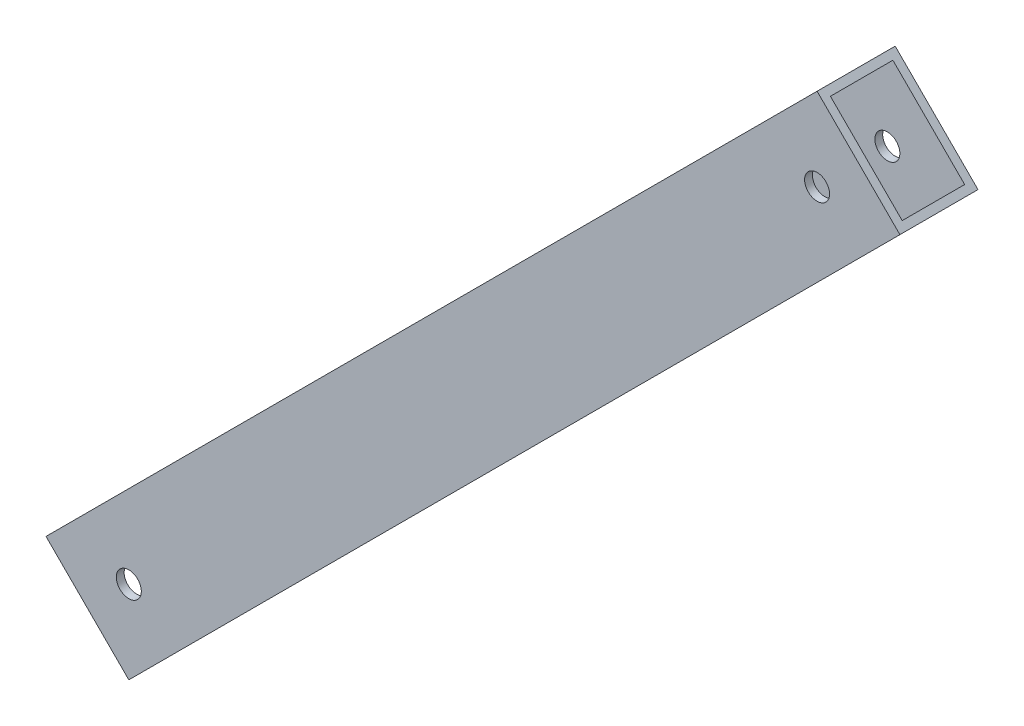
ISO-10303-21;
HEADER;
FILE_DESCRIPTION(('STEP AP214'),'2;1');
FILE_NAME('part.step','',(''),(''),'','','');
FILE_SCHEMA(('AUTOMOTIVE_DESIGN { 1 0 10303 214 1 1 1 1 }'));
ENDSEC;
DATA;
#1=APPLICATION_CONTEXT('core data for automotive mechanical design processes');
#2=APPLICATION_PROTOCOL_DEFINITION('international standard','automotive_design',2000,#1);
#3=PRODUCT_CONTEXT('',#1,'mechanical');
#4=PRODUCT('Part','Part','',(#3));
#5=PRODUCT_RELATED_PRODUCT_CATEGORY('part','',(#4));
#6=PRODUCT_DEFINITION_FORMATION('','',#4);
#7=PRODUCT_DEFINITION_CONTEXT('part definition',#1,'design');
#8=PRODUCT_DEFINITION('design','',#6,#7);
#9=PRODUCT_DEFINITION_SHAPE('','',#8);
#10=(LENGTH_UNIT() NAMED_UNIT(*) SI_UNIT(.MILLI.,.METRE.));
#11=(NAMED_UNIT(*) PLANE_ANGLE_UNIT() SI_UNIT($,.RADIAN.));
#12=(NAMED_UNIT(*) SI_UNIT($,.STERADIAN.) SOLID_ANGLE_UNIT());
#13=UNCERTAINTY_MEASURE_WITH_UNIT(LENGTH_MEASURE(1.E-05),#10,'distance_accuracy_value','');
#14=(GEOMETRIC_REPRESENTATION_CONTEXT(3) GLOBAL_UNCERTAINTY_ASSIGNED_CONTEXT((#13)) GLOBAL_UNIT_ASSIGNED_CONTEXT((#10,
#11,#12)) REPRESENTATION_CONTEXT('',''));
#15=CARTESIAN_POINT('',(0.,0.,0.));
#16=DIRECTION('',(0.,0.,1.));
#17=DIRECTION('',(1.,0.,0.));
#18=AXIS2_PLACEMENT_3D('',#15,#16,#17);
#19=CARTESIAN_POINT('',(177.355249324951,-95.6447506750465,10.));
#20=DIRECTION('',(0.,0.,-1.));
#21=DIRECTION('',(-1.,0.,0.));
#22=AXIS2_PLACEMENT_3D('',#19,#20,#21);
#23=CYLINDRICAL_SURFACE('',#22,1.59999999999996);
#24=CARTESIAN_POINT('',(177.355249324951,-95.6447506750465,9.));
#25=DIRECTION('',(0.,0.,1.));
#26=DIRECTION('',(1.,0.,0.));
#27=AXIS2_PLACEMENT_3D('',#24,#25,#26);
#28=CIRCLE('',#27,1.59999999999996);
#29=CARTESIAN_POINT('',(178.955249324951,-95.6447506750465,9.));
#30=VERTEX_POINT('',#29);
#31=EDGE_CURVE('E140',#30,#30,#28,.T.);
#32=ORIENTED_EDGE('',*,*,#31,.F.);
#33=EDGE_LOOP('',(#32));
#34=FACE_BOUND('',#33,.T.);
#35=CARTESIAN_POINT('',(177.355249324951,-95.6447506750465,10.));
#36=DIRECTION('',(0.,0.,1.));
#37=DIRECTION('',(1.,0.,0.));
#38=AXIS2_PLACEMENT_3D('',#35,#36,#37);
#39=CIRCLE('',#38,1.59999999999996);
#40=CARTESIAN_POINT('',(178.955249324951,-95.6447506750465,10.));
#41=VERTEX_POINT('',#40);
#42=EDGE_CURVE('E159',#41,#41,#39,.T.);
#43=ORIENTED_EDGE('',*,*,#42,.T.);
#44=EDGE_LOOP('',(#43));
#45=FACE_BOUND('',#44,.T.);
#46=ADVANCED_FACE('F33',(#34,#45),#23,.F.);
#47=CARTESIAN_POINT('',(265.500000000001,-7.49999999999862,10.));
#48=DIRECTION('',(0.,0.,-1.));
#49=DIRECTION('',(-1.,0.,0.));
#50=AXIS2_PLACEMENT_3D('',#47,#48,#49);
#51=CYLINDRICAL_SURFACE('',#50,1.59999999999996);
#52=CARTESIAN_POINT('',(265.500000000001,-7.49999999999862,9.));
#53=DIRECTION('',(0.,0.,1.));
#54=DIRECTION('',(1.,0.,0.));
#55=AXIS2_PLACEMENT_3D('',#52,#53,#54);
#56=CIRCLE('',#55,1.59999999999996);
#57=CARTESIAN_POINT('',(267.100000000001,-7.49999999999862,9.));
#58=VERTEX_POINT('',#57);
#59=EDGE_CURVE('E37',#58,#58,#56,.T.);
#60=ORIENTED_EDGE('',*,*,#59,.F.);
#61=EDGE_LOOP('',(#60));
#62=FACE_BOUND('',#61,.T.);
#63=CARTESIAN_POINT('',(265.500000000001,-7.49999999999862,10.));
#64=DIRECTION('',(0.,0.,1.));
#65=DIRECTION('',(1.,0.,0.));
#66=AXIS2_PLACEMENT_3D('',#63,#64,#65);
#67=CIRCLE('',#66,1.59999999999996);
#68=CARTESIAN_POINT('',(267.100000000001,-7.49999999999862,10.));
#69=VERTEX_POINT('',#68);
#70=EDGE_CURVE('E153',#69,#69,#67,.T.);
#71=ORIENTED_EDGE('',*,*,#70,.T.);
#72=EDGE_LOOP('',(#71));
#73=FACE_BOUND('',#72,.T.);
#74=ADVANCED_FACE('F203',(#62,#73),#51,.F.);
#75=CARTESIAN_POINT('',(195.032918854614,-95.6447506750468,5.00000000000004));
#76=DIRECTION('',(-0.707106781186537,0.707106781186558,0.));
#77=DIRECTION('',(-0.707106781186558,-0.707106781186537,0.));
#78=AXIS2_PLACEMENT_3D('',#75,#76,#77);
#79=CYLINDRICAL_SURFACE('',#78,1.6);
#80=CARTESIAN_POINT('',(181.59789001207,-82.2097218325023,5.00000000000004));
#81=DIRECTION('',(-0.707106781186537,0.707106781186558,0.));
#82=DIRECTION('',(-0.707106781186558,-0.707106781186537,0.));
#83=AXIS2_PLACEMENT_3D('',#80,#81,#82);
#84=CIRCLE('',#83,1.6);
#85=CARTESIAN_POINT('',(180.466519162172,-83.3410926824007,5.00000000000004));
#86=VERTEX_POINT('',#85);
#87=EDGE_CURVE('E130',#86,#86,#84,.F.);
#88=ORIENTED_EDGE('',*,*,#87,.T.);
#89=EDGE_LOOP('',(#88));
#90=FACE_BOUND('',#89,.T.);
#91=CARTESIAN_POINT('',(180.890783230884,-81.5026150513157,5.00000000000004));
#92=DIRECTION('',(-0.707106781186537,0.707106781186558,0.));
#93=DIRECTION('',(-0.707106781186558,-0.707106781186537,0.));
#94=AXIS2_PLACEMENT_3D('',#91,#92,#93);
#95=CIRCLE('',#94,1.6);
#96=CARTESIAN_POINT('',(179.759412380985,-82.6339859012141,5.00000000000004));
#97=VERTEX_POINT('',#96);
#98=EDGE_CURVE('E146',#97,#97,#95,.T.);
#99=ORIENTED_EDGE('',*,*,#98,.T.);
#100=EDGE_LOOP('',(#99));
#101=FACE_BOUND('',#100,.T.);
#102=ADVANCED_FACE('F217',(#90,#101),#79,.F.);
#103=CARTESIAN_POINT('',(0.,0.,10.));
#104=DIRECTION('',(0.,0.,-1.));
#105=DIRECTION('',(-1.,0.,0.));
#106=AXIS2_PLACEMENT_3D('',#103,#104,#105);
#107=PLANE('',#106);
#108=DIRECTION('',(0.707106781186559,0.707106781186536,0.));
#109=VECTOR('',#108,1.);
#110=CARTESIAN_POINT('',(276.1066017178,-7.49999999999881,10.));
#111=LINE('',#110,#109);
#112=CARTESIAN_POINT('',(177.355249324951,-106.251352392845,10.));
#113=VERTEX_POINT('',#112);
#114=CARTESIAN_POINT('',(276.1066017178,-7.49999999999881,10.));
#115=VERTEX_POINT('',#114);
#116=EDGE_CURVE('E165',#113,#115,#111,.T.);
#117=ORIENTED_EDGE('',*,*,#116,.T.);
#118=DIRECTION('',(-0.707106781186539,0.707106781186556,0.));
#119=VECTOR('',#118,1.);
#120=CARTESIAN_POINT('',(265.500000000001,3.10660171779954,10.));
#121=LINE('',#120,#119);
#122=CARTESIAN_POINT('',(265.500000000001,3.10660171779954,10.));
#123=VERTEX_POINT('',#122);
#124=EDGE_CURVE('E168',#115,#123,#121,.T.);
#125=ORIENTED_EDGE('',*,*,#124,.T.);
#126=DIRECTION('',(-0.707106781186559,-0.707106781186537,0.));
#127=VECTOR('',#126,1.);
#128=CARTESIAN_POINT('',(166.748647607152,-95.6447506750464,10.));
#129=LINE('',#128,#127);
#130=CARTESIAN_POINT('',(166.748647607152,-95.6447506750464,10.));
#131=VERTEX_POINT('',#130);
#132=EDGE_CURVE('E171',#123,#131,#129,.T.);
#133=ORIENTED_EDGE('',*,*,#132,.T.);
#134=DIRECTION('',(0.707106781186537,-0.707106781186558,0.));
#135=VECTOR('',#134,1.);
#136=CARTESIAN_POINT('',(177.355249324951,-106.251352392845,10.));
#137=LINE('',#136,#135);
#138=EDGE_CURVE('E173',#131,#113,#137,.T.);
#139=ORIENTED_EDGE('',*,*,#138,.T.);
#140=EDGE_LOOP('',(#117,#125,#133,#139));
#141=FACE_BOUND('',#140,.T.);
#142=ORIENTED_EDGE('',*,*,#42,.F.);
#143=EDGE_LOOP('',(#142));
#144=FACE_BOUND('',#143,.T.);
#145=ORIENTED_EDGE('',*,*,#70,.F.);
#146=EDGE_LOOP('',(#145));
#147=FACE_BOUND('',#146,.T.);
#148=ADVANCED_FACE('F208',(#141,#144,#147),#107,.F.);
#149=CARTESIAN_POINT('',(0.,0.,0.));
#150=DIRECTION('',(0.,0.,-1.));
#151=DIRECTION('',(-1.,0.,0.));
#152=AXIS2_PLACEMENT_3D('',#149,#150,#151);
#153=PLANE('',#152);
#154=CARTESIAN_POINT('',(177.355249324951,-95.6447506750465,0.));
#155=DIRECTION('',(0.,0.,1.));
#156=DIRECTION('',(1.,0.,0.));
#157=AXIS2_PLACEMENT_3D('',#154,#155,#156);
#158=CIRCLE('',#157,1.59999999999996);
#159=CARTESIAN_POINT('',(178.955249324951,-95.6447506750465,0.));
#160=VERTEX_POINT('',#159);
#161=EDGE_CURVE('E156',#160,#160,#158,.T.);
#162=ORIENTED_EDGE('',*,*,#161,.T.);
#163=EDGE_LOOP('',(#162));
#164=FACE_BOUND('',#163,.T.);
#165=DIRECTION('',(0.707106781186559,0.707106781186536,0.));
#166=VECTOR('',#165,1.);
#167=CARTESIAN_POINT('',(276.1066017178,-7.49999999999881,0.));
#168=LINE('',#167,#166);
#169=CARTESIAN_POINT('',(177.355249324951,-106.251352392845,0.));
#170=VERTEX_POINT('',#169);
#171=CARTESIAN_POINT('',(276.1066017178,-7.49999999999881,0.));
#172=VERTEX_POINT('',#171);
#173=EDGE_CURVE('E162',#170,#172,#168,.T.);
#174=ORIENTED_EDGE('',*,*,#173,.F.);
#175=DIRECTION('',(0.707106781186537,-0.707106781186558,0.));
#176=VECTOR('',#175,1.);
#177=CARTESIAN_POINT('',(177.355249324951,-106.251352392845,0.));
#178=LINE('',#177,#176);
#179=CARTESIAN_POINT('',(166.748647607152,-95.6447506750464,0.));
#180=VERTEX_POINT('',#179);
#181=EDGE_CURVE('E169',#180,#170,#178,.T.);
#182=ORIENTED_EDGE('',*,*,#181,.F.);
#183=DIRECTION('',(-0.707106781186559,-0.707106781186537,0.));
#184=VECTOR('',#183,1.);
#185=CARTESIAN_POINT('',(166.748647607152,-95.6447506750464,0.));
#186=LINE('',#185,#184);
#187=CARTESIAN_POINT('',(265.500000000001,3.10660171779954,0.));
#188=VERTEX_POINT('',#187);
#189=EDGE_CURVE('E180',#188,#180,#186,.T.);
#190=ORIENTED_EDGE('',*,*,#189,.F.);
#191=DIRECTION('',(-0.707106781186539,0.707106781186556,0.));
#192=VECTOR('',#191,1.);
#193=CARTESIAN_POINT('',(265.500000000001,3.10660171779954,0.));
#194=LINE('',#193,#192);
#195=EDGE_CURVE('E178',#172,#188,#194,.T.);
#196=ORIENTED_EDGE('',*,*,#195,.F.);
#197=EDGE_LOOP('',(#174,#182,#190,#196));
#198=FACE_BOUND('',#197,.T.);
#199=CARTESIAN_POINT('',(265.500000000001,-7.49999999999862,0.));
#200=DIRECTION('',(0.,0.,1.));
#201=DIRECTION('',(1.,0.,0.));
#202=AXIS2_PLACEMENT_3D('',#199,#200,#201);
#203=CIRCLE('',#202,1.59999999999996);
#204=CARTESIAN_POINT('',(267.100000000001,-7.49999999999862,0.));
#205=VERTEX_POINT('',#204);
#206=EDGE_CURVE('E152',#205,#205,#203,.T.);
#207=ORIENTED_EDGE('',*,*,#206,.T.);
#208=EDGE_LOOP('',(#207));
#209=FACE_BOUND('',#208,.T.);
#210=ADVANCED_FACE('F206',(#164,#198,#209),#153,.T.);
#211=CARTESIAN_POINT('',(276.1066017178,-7.49999999999881,10.));
#212=DIRECTION('',(-0.707106781186536,0.707106781186559,0.));
#213=DIRECTION('',(-0.707106781186559,-0.707106781186536,0.));
#214=AXIS2_PLACEMENT_3D('',#211,#212,#213);
#215=PLANE('',#214);
#216=CARTESIAN_POINT('',(191.497384948682,-92.109216769114,5.00000000000004));
#217=DIRECTION('',(-0.707106781186536,0.707106781186559,0.));
#218=DIRECTION('',(-0.707106781186559,-0.707106781186536,0.));
#219=AXIS2_PLACEMENT_3D('',#216,#217,#218);
#220=CIRCLE('',#219,1.6);
#221=CARTESIAN_POINT('',(190.366014098783,-93.2405876190125,5.00000000000004));
#222=VERTEX_POINT('',#221);
#223=EDGE_CURVE('E149',#222,#222,#220,.T.);
#224=ORIENTED_EDGE('',*,*,#223,.T.);
#225=EDGE_LOOP('',(#224));
#226=FACE_BOUND('',#225,.T.);
#227=ORIENTED_EDGE('',*,*,#173,.T.);
#228=DIRECTION('',(0.,0.,-1.));
#229=VECTOR('',#228,1.);
#230=CARTESIAN_POINT('',(276.1066017178,-7.49999999999881,10.));
#231=LINE('',#230,#229);
#232=EDGE_CURVE('E11',#115,#172,#231,.T.);
#233=ORIENTED_EDGE('',*,*,#232,.F.);
#234=ORIENTED_EDGE('',*,*,#116,.F.);
#235=DIRECTION('',(0.,0.,-1.));
#236=VECTOR('',#235,1.);
#237=CARTESIAN_POINT('',(177.355249324951,-106.251352392845,10.));
#238=LINE('',#237,#236);
#239=EDGE_CURVE('E175',#113,#170,#238,.T.);
#240=ORIENTED_EDGE('',*,*,#239,.T.);
#241=EDGE_LOOP('',(#227,#233,#234,#240));
#242=FACE_BOUND('',#241,.T.);
#243=ADVANCED_FACE('F35',(#226,#242),#215,.F.);
#244=CARTESIAN_POINT('',(265.500000000001,3.10660171779954,10.));
#245=DIRECTION('',(-0.707106781186556,-0.707106781186539,0.));
#246=DIRECTION('',(0.707106781186539,-0.707106781186556,0.));
#247=AXIS2_PLACEMENT_3D('',#244,#245,#246);
#248=PLANE('',#247);
#249=DIRECTION('',(-0.707106781186539,0.707106781186556,0.));
#250=VECTOR('',#249,1.);
#251=CARTESIAN_POINT('',(265.500000000001,3.10660171779954,9.));
#252=LINE('',#251,#250);
#253=CARTESIAN_POINT('',(275.399494936613,-6.79289321881216,9.));
#254=VERTEX_POINT('',#253);
#255=CARTESIAN_POINT('',(266.207106781188,2.39949493661297,9.));
#256=VERTEX_POINT('',#255);
#257=EDGE_CURVE('E143',#254,#256,#252,.T.);
#258=ORIENTED_EDGE('',*,*,#257,.T.);
#259=DIRECTION('',(0.,0.,-1.));
#260=VECTOR('',#259,1.);
#261=CARTESIAN_POINT('',(266.207106781188,2.39949493661298,10.));
#262=LINE('',#261,#260);
#263=CARTESIAN_POINT('',(266.207106781188,2.39949493661297,1.));
#264=VERTEX_POINT('',#263);
#265=EDGE_CURVE('E131',#256,#264,#262,.T.);
#266=ORIENTED_EDGE('',*,*,#265,.T.);
#267=DIRECTION('',(0.707106781186539,-0.707106781186556,0.));
#268=VECTOR('',#267,1.);
#269=CARTESIAN_POINT('',(265.500000000001,3.10660171779954,0.999999999999999));
#270=LINE('',#269,#268);
#271=CARTESIAN_POINT('',(275.399494936613,-6.79289321881217,1.));
#272=VERTEX_POINT('',#271);
#273=EDGE_CURVE('E138',#264,#272,#270,.T.);
#274=ORIENTED_EDGE('',*,*,#273,.T.);
#275=DIRECTION('',(0.,0.,1.));
#276=VECTOR('',#275,1.);
#277=CARTESIAN_POINT('',(275.399494936613,-6.79289321881214,10.));
#278=LINE('',#277,#276);
#279=EDGE_CURVE('E106',#272,#254,#278,.T.);
#280=ORIENTED_EDGE('',*,*,#279,.T.);
#281=EDGE_LOOP('',(#258,#266,#274,#280));
#282=FACE_BOUND('',#281,.T.);
#283=ORIENTED_EDGE('',*,*,#195,.T.);
#284=DIRECTION('',(0.,0.,-1.));
#285=VECTOR('',#284,1.);
#286=CARTESIAN_POINT('',(265.500000000001,3.10660171779954,10.));
#287=LINE('',#286,#285);
#288=EDGE_CURVE('E42',#123,#188,#287,.T.);
#289=ORIENTED_EDGE('',*,*,#288,.F.);
#290=ORIENTED_EDGE('',*,*,#124,.F.);
#291=ORIENTED_EDGE('',*,*,#232,.T.);
#292=EDGE_LOOP('',(#283,#289,#290,#291));
#293=FACE_BOUND('',#292,.T.);
#294=ADVANCED_FACE('F215',(#282,#293),#248,.F.);
#295=CARTESIAN_POINT('',(166.748647607152,-95.6447506750464,10.));
#296=DIRECTION('',(0.707106781186537,-0.707106781186559,0.));
#297=DIRECTION('',(0.707106781186559,0.707106781186537,0.));
#298=AXIS2_PLACEMENT_3D('',#295,#296,#297);
#299=PLANE('',#298);
#300=ORIENTED_EDGE('',*,*,#98,.F.);
#301=EDGE_LOOP('',(#300));
#302=FACE_BOUND('',#301,.T.);
#303=ORIENTED_EDGE('',*,*,#189,.T.);
#304=DIRECTION('',(0.,0.,-1.));
#305=VECTOR('',#304,1.);
#306=CARTESIAN_POINT('',(166.748647607152,-95.6447506750464,10.));
#307=LINE('',#306,#305);
#308=EDGE_CURVE('E185',#131,#180,#307,.T.);
#309=ORIENTED_EDGE('',*,*,#308,.F.);
#310=ORIENTED_EDGE('',*,*,#132,.F.);
#311=ORIENTED_EDGE('',*,*,#288,.T.);
#312=EDGE_LOOP('',(#303,#309,#310,#311));
#313=FACE_BOUND('',#312,.T.);
#314=ADVANCED_FACE('F237',(#302,#313),#299,.F.);
#315=CARTESIAN_POINT('',(177.355249324951,-106.251352392845,10.));
#316=DIRECTION('',(0.707106781186558,0.707106781186537,0.));
#317=DIRECTION('',(-0.707106781186537,0.707106781186558,0.));
#318=AXIS2_PLACEMENT_3D('',#315,#316,#317);
#319=PLANE('',#318);
#320=DIRECTION('',(0.707106781186537,-0.707106781186558,0.));
#321=VECTOR('',#320,1.);
#322=CARTESIAN_POINT('',(167.455754388339,-96.3518574562329,1.));
#323=LINE('',#322,#321);
#324=CARTESIAN_POINT('',(167.455754388339,-96.3518574562329,0.999999999999999));
#325=VERTEX_POINT('',#324);
#326=CARTESIAN_POINT('',(176.648142543764,-105.544245611658,1.));
#327=VERTEX_POINT('',#326);
#328=EDGE_CURVE('E112',#325,#327,#323,.T.);
#329=ORIENTED_EDGE('',*,*,#328,.F.);
#330=DIRECTION('',(0.,0.,-1.));
#331=VECTOR('',#330,1.);
#332=CARTESIAN_POINT('',(167.455754388339,-96.3518574562329,9.));
#333=LINE('',#332,#331);
#334=CARTESIAN_POINT('',(167.455754388339,-96.3518574562329,9.));
#335=VERTEX_POINT('',#334);
#336=EDGE_CURVE('E58',#335,#325,#333,.T.);
#337=ORIENTED_EDGE('',*,*,#336,.F.);
#338=DIRECTION('',(-0.707106781186537,0.707106781186558,0.));
#339=VECTOR('',#338,1.);
#340=CARTESIAN_POINT('',(176.648142543764,-105.544245611658,9.));
#341=LINE('',#340,#339);
#342=CARTESIAN_POINT('',(176.648142543764,-105.544245611658,9.));
#343=VERTEX_POINT('',#342);
#344=EDGE_CURVE('E119',#343,#335,#341,.T.);
#345=ORIENTED_EDGE('',*,*,#344,.F.);
#346=DIRECTION('',(0.,0.,1.));
#347=VECTOR('',#346,1.);
#348=CARTESIAN_POINT('',(176.648142543764,-105.544245611658,1.));
#349=LINE('',#348,#347);
#350=EDGE_CURVE('E103',#327,#343,#349,.T.);
#351=ORIENTED_EDGE('',*,*,#350,.F.);
#352=EDGE_LOOP('',(#329,#337,#345,#351));
#353=FACE_BOUND('',#352,.T.);
#354=ORIENTED_EDGE('',*,*,#181,.T.);
#355=ORIENTED_EDGE('',*,*,#239,.F.);
#356=ORIENTED_EDGE('',*,*,#138,.F.);
#357=ORIENTED_EDGE('',*,*,#308,.T.);
#358=EDGE_LOOP('',(#354,#355,#356,#357));
#359=FACE_BOUND('',#358,.T.);
#360=ADVANCED_FACE('F116',(#353,#359),#319,.F.);
#361=CARTESIAN_POINT('',(177.355249324951,-95.6447506750465,0.999999999999999));
#362=DIRECTION('',(0.,0.,-1.));
#363=DIRECTION('',(-1.,0.,0.));
#364=AXIS2_PLACEMENT_3D('',#361,#362,#363);
#365=CIRCLE('',#364,1.59999999999996);
#366=CARTESIAN_POINT('',(175.755249324951,-95.6447506750465,0.999999999999999));
#367=VERTEX_POINT('',#366);
#368=EDGE_CURVE('E135',#367,#367,#365,.T.);
#369=ORIENTED_EDGE('',*,*,#368,.F.);
#370=EDGE_LOOP('',(#369));
#371=FACE_BOUND('',#370,.T.);
#372=ORIENTED_EDGE('',*,*,#161,.F.);
#373=EDGE_LOOP('',(#372));
#374=FACE_BOUND('',#373,.T.);
#375=ADVANCED_FACE('F201',(#371,#374),#23,.F.);
#376=CARTESIAN_POINT('',(265.500000000001,-7.49999999999862,0.999999999999999));
#377=DIRECTION('',(0.,0.,-1.));
#378=DIRECTION('',(-1.,0.,0.));
#379=AXIS2_PLACEMENT_3D('',#376,#377,#378);
#380=CIRCLE('',#379,1.59999999999996);
#381=CARTESIAN_POINT('',(263.900000000001,-7.49999999999862,0.999999999999999));
#382=VERTEX_POINT('',#381);
#383=EDGE_CURVE('E134',#382,#382,#380,.T.);
#384=ORIENTED_EDGE('',*,*,#383,.F.);
#385=EDGE_LOOP('',(#384));
#386=FACE_BOUND('',#385,.T.);
#387=ORIENTED_EDGE('',*,*,#206,.F.);
#388=EDGE_LOOP('',(#387));
#389=FACE_BOUND('',#388,.T.);
#390=ADVANCED_FACE('F197',(#386,#389),#51,.F.);
#391=CARTESIAN_POINT('',(190.790278167495,-91.4021099879274,5.00000000000004));
#392=DIRECTION('',(0.707106781186537,-0.707106781186558,0.));
#393=DIRECTION('',(0.707106781186558,0.707106781186537,0.));
#394=AXIS2_PLACEMENT_3D('',#391,#392,#393);
#395=CIRCLE('',#394,1.6);
#396=CARTESIAN_POINT('',(191.921649017394,-90.270739138029,5.00000000000004));
#397=VERTEX_POINT('',#396);
#398=EDGE_CURVE('E126',#397,#397,#395,.F.);
#399=ORIENTED_EDGE('',*,*,#398,.T.);
#400=EDGE_LOOP('',(#399));
#401=FACE_BOUND('',#400,.T.);
#402=ORIENTED_EDGE('',*,*,#223,.F.);
#403=EDGE_LOOP('',(#402));
#404=FACE_BOUND('',#403,.T.);
#405=ADVANCED_FACE('F200',(#401,#404),#79,.F.);
#406=CARTESIAN_POINT('',(883.754923730322,601.562535574879,9.));
#407=DIRECTION('',(0.,0.,1.));
#408=DIRECTION('',(1.,0.,0.));
#409=AXIS2_PLACEMENT_3D('',#406,#407,#408);
#410=PLANE('',#409);
#411=ORIENTED_EDGE('',*,*,#31,.T.);
#412=EDGE_LOOP('',(#411));
#413=FACE_BOUND('',#412,.T.);
#414=ORIENTED_EDGE('',*,*,#59,.T.);
#415=EDGE_LOOP('',(#414));
#416=FACE_BOUND('',#415,.T.);
#417=DIRECTION('',(-0.707106781186558,-0.707106781186537,0.));
#418=VECTOR('',#417,1.);
#419=CARTESIAN_POINT('',(883.754923730322,601.562535574879,9.));
#420=LINE('',#419,#418);
#421=EDGE_CURVE('E108',#254,#343,#420,.T.);
#422=ORIENTED_EDGE('',*,*,#421,.T.);
#423=ORIENTED_EDGE('',*,*,#344,.T.);
#424=DIRECTION('',(-0.707106781186558,-0.707106781186537,0.));
#425=VECTOR('',#424,1.);
#426=CARTESIAN_POINT('',(874.562535574897,610.754923730304,9.));
#427=LINE('',#426,#425);
#428=EDGE_CURVE('E124',#256,#335,#427,.T.);
#429=ORIENTED_EDGE('',*,*,#428,.F.);
#430=ORIENTED_EDGE('',*,*,#257,.F.);
#431=EDGE_LOOP('',(#422,#423,#429,#430));
#432=FACE_BOUND('',#431,.T.);
#433=ADVANCED_FACE('F244',(#413,#416,#432),#410,.F.);
#434=CARTESIAN_POINT('',(874.562535574897,610.754923730304,1.));
#435=DIRECTION('',(0.,0.,-1.));
#436=DIRECTION('',(-1.,0.,0.));
#437=AXIS2_PLACEMENT_3D('',#434,#435,#436);
#438=PLANE('',#437);
#439=ORIENTED_EDGE('',*,*,#368,.T.);
#440=EDGE_LOOP('',(#439));
#441=FACE_BOUND('',#440,.T.);
#442=ORIENTED_EDGE('',*,*,#383,.T.);
#443=EDGE_LOOP('',(#442));
#444=FACE_BOUND('',#443,.T.);
#445=DIRECTION('',(-0.707106781186558,-0.707106781186537,0.));
#446=VECTOR('',#445,1.);
#447=CARTESIAN_POINT('',(874.562535574897,610.754923730304,1.));
#448=LINE('',#447,#446);
#449=EDGE_CURVE('E109',#264,#325,#448,.T.);
#450=ORIENTED_EDGE('',*,*,#449,.T.);
#451=ORIENTED_EDGE('',*,*,#328,.T.);
#452=DIRECTION('',(-0.707106781186558,-0.707106781186537,0.));
#453=VECTOR('',#452,1.);
#454=CARTESIAN_POINT('',(883.754923730322,601.562535574879,1.));
#455=LINE('',#454,#453);
#456=EDGE_CURVE('E50',#272,#327,#455,.T.);
#457=ORIENTED_EDGE('',*,*,#456,.F.);
#458=ORIENTED_EDGE('',*,*,#273,.F.);
#459=EDGE_LOOP('',(#450,#451,#457,#458));
#460=FACE_BOUND('',#459,.T.);
#461=ADVANCED_FACE('F113',(#441,#444,#460),#438,.F.);
#462=CARTESIAN_POINT('',(874.562535574897,610.754923730304,9.));
#463=DIRECTION('',(-0.707106781186537,0.707106781186558,0.));
#464=DIRECTION('',(-0.707106781186558,-0.707106781186537,0.));
#465=AXIS2_PLACEMENT_3D('',#462,#463,#464);
#466=PLANE('',#465);
#467=ORIENTED_EDGE('',*,*,#87,.F.);
#468=EDGE_LOOP('',(#467));
#469=FACE_BOUND('',#468,.T.);
#470=ORIENTED_EDGE('',*,*,#428,.T.);
#471=ORIENTED_EDGE('',*,*,#336,.T.);
#472=ORIENTED_EDGE('',*,*,#449,.F.);
#473=ORIENTED_EDGE('',*,*,#265,.F.);
#474=EDGE_LOOP('',(#470,#471,#472,#473));
#475=FACE_BOUND('',#474,.T.);
#476=ADVANCED_FACE('F243',(#469,#475),#466,.F.);
#477=CARTESIAN_POINT('',(883.754923730322,601.562535574879,1.));
#478=DIRECTION('',(0.707106781186537,-0.707106781186558,0.));
#479=DIRECTION('',(0.707106781186558,0.707106781186537,0.));
#480=AXIS2_PLACEMENT_3D('',#477,#478,#479);
#481=PLANE('',#480);
#482=ORIENTED_EDGE('',*,*,#398,.F.);
#483=EDGE_LOOP('',(#482));
#484=FACE_BOUND('',#483,.T.);
#485=ORIENTED_EDGE('',*,*,#456,.T.);
#486=ORIENTED_EDGE('',*,*,#350,.T.);
#487=ORIENTED_EDGE('',*,*,#421,.F.);
#488=ORIENTED_EDGE('',*,*,#279,.F.);
#489=EDGE_LOOP('',(#485,#486,#487,#488));
#490=FACE_BOUND('',#489,.T.);
#491=ADVANCED_FACE('F100',(#484,#490),#481,.F.);
#492=CLOSED_SHELL('',(#46,#74,#102,#148,#210,#243,#294,#314,#360,#375,#390,#405,#433,#461,#476,#491));
#493=MANIFOLD_SOLID_BREP('B2',#492);
#494=ADVANCED_BREP_SHAPE_REPRESENTATION('',(#18,#493),#14);
#495=SHAPE_DEFINITION_REPRESENTATION(#9,#494);
ENDSEC;
END-ISO-10303-21;
